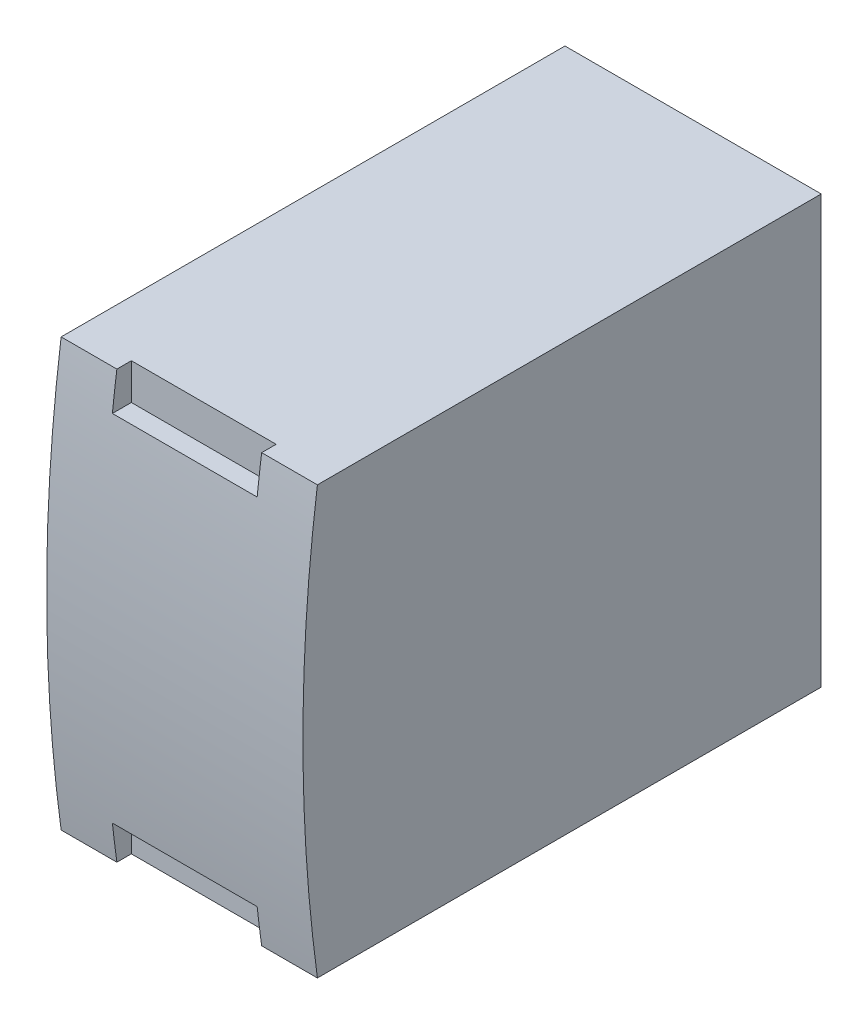
ISO-10303-21;
HEADER;
FILE_DESCRIPTION(('STEP AP214'),'2;1');
FILE_NAME('part.step','',(''),(''),'','','');
FILE_SCHEMA(('AUTOMOTIVE_DESIGN { 1 0 10303 214 1 1 1 1 }'));
ENDSEC;
DATA;
#1=APPLICATION_CONTEXT('core data for automotive mechanical design processes');
#2=APPLICATION_PROTOCOL_DEFINITION('international standard','automotive_design',2000,#1);
#3=PRODUCT_CONTEXT('',#1,'mechanical');
#4=PRODUCT('Part','Part','',(#3));
#5=PRODUCT_RELATED_PRODUCT_CATEGORY('part','',(#4));
#6=PRODUCT_DEFINITION_FORMATION('','',#4);
#7=PRODUCT_DEFINITION_CONTEXT('part definition',#1,'design');
#8=PRODUCT_DEFINITION('design','',#6,#7);
#9=PRODUCT_DEFINITION_SHAPE('','',#8);
#10=(LENGTH_UNIT() NAMED_UNIT(*) SI_UNIT(.MILLI.,.METRE.));
#11=(NAMED_UNIT(*) PLANE_ANGLE_UNIT() SI_UNIT($,.RADIAN.));
#12=(NAMED_UNIT(*) SI_UNIT($,.STERADIAN.) SOLID_ANGLE_UNIT());
#13=UNCERTAINTY_MEASURE_WITH_UNIT(LENGTH_MEASURE(1.E-05),#10,'distance_accuracy_value','');
#14=(GEOMETRIC_REPRESENTATION_CONTEXT(3) GLOBAL_UNCERTAINTY_ASSIGNED_CONTEXT((#13)) GLOBAL_UNIT_ASSIGNED_CONTEXT((#10,
#11,#12)) REPRESENTATION_CONTEXT('',''));
#15=CARTESIAN_POINT('',(0.,0.,0.));
#16=DIRECTION('',(0.,0.,1.));
#17=DIRECTION('',(1.,0.,0.));
#18=AXIS2_PLACEMENT_3D('',#15,#16,#17);
#19=CARTESIAN_POINT('',(0.,0.,85.852));
#20=DIRECTION('',(0.,0.,1.));
#21=DIRECTION('',(1.,0.,0.));
#22=AXIS2_PLACEMENT_3D('',#19,#20,#21);
#23=PLANE('',#22);
#24=DIRECTION('',(0.,1.,0.));
#25=VECTOR('',#24,1.);
#26=CARTESIAN_POINT('',(35.179,68.58,85.852));
#27=LINE('',#26,#25);
#28=CARTESIAN_POINT('',(35.179,68.58,85.852));
#29=VERTEX_POINT('',#28);
#30=CARTESIAN_POINT('',(35.179,74.93,85.852));
#31=VERTEX_POINT('',#30);
#32=EDGE_CURVE('E198',#29,#31,#27,.T.);
#33=ORIENTED_EDGE('',*,*,#32,.T.);
#34=DIRECTION('',(1.,0.,0.));
#35=VECTOR('',#34,1.);
#36=CARTESIAN_POINT('',(44.958,74.93,85.852));
#37=LINE('',#36,#35);
#38=CARTESIAN_POINT('',(9.77899999999998,74.93,85.852));
#39=VERTEX_POINT('',#38);
#40=EDGE_CURVE('E155',#39,#31,#37,.T.);
#41=ORIENTED_EDGE('',*,*,#40,.F.);
#42=DIRECTION('',(0.,-1.,0.));
#43=VECTOR('',#42,1.);
#44=CARTESIAN_POINT('',(9.77899999999999,74.93,85.852));
#45=LINE('',#44,#43);
#46=CARTESIAN_POINT('',(9.77899999999999,68.58,85.852));
#47=VERTEX_POINT('',#46);
#48=EDGE_CURVE('E160',#39,#47,#45,.T.);
#49=ORIENTED_EDGE('',*,*,#48,.T.);
#50=DIRECTION('',(1.,0.,0.));
#51=VECTOR('',#50,1.);
#52=CARTESIAN_POINT('',(9.77899999999999,68.58,85.852));
#53=LINE('',#52,#51);
#54=EDGE_CURVE('E169',#47,#29,#53,.T.);
#55=ORIENTED_EDGE('',*,*,#54,.T.);
#56=EDGE_LOOP('',(#33,#41,#49,#55));
#57=FACE_BOUND('',#56,.T.);
#58=ADVANCED_FACE('F17',(#57),#23,.T.);
#59=CARTESIAN_POINT('',(0.,0.,85.852));
#60=DIRECTION('',(0.,0.,1.));
#61=DIRECTION('',(1.,0.,0.));
#62=AXIS2_PLACEMENT_3D('',#59,#60,#61);
#63=PLANE('',#62);
#64=DIRECTION('',(0.,-1.,0.));
#65=VECTOR('',#64,1.);
#66=CARTESIAN_POINT('',(9.77899999999999,6.34999999999999,85.852));
#67=LINE('',#66,#65);
#68=CARTESIAN_POINT('',(9.77899999999999,6.34999999999999,85.852));
#69=VERTEX_POINT('',#68);
#70=CARTESIAN_POINT('',(9.77899999999999,0.,85.852));
#71=VERTEX_POINT('',#70);
#72=EDGE_CURVE('E83',#69,#71,#67,.T.);
#73=ORIENTED_EDGE('',*,*,#72,.T.);
#74=DIRECTION('',(1.,0.,0.));
#75=VECTOR('',#74,1.);
#76=CARTESIAN_POINT('',(0.,0.,85.852));
#77=LINE('',#76,#75);
#78=CARTESIAN_POINT('',(35.179,0.,85.852));
#79=VERTEX_POINT('',#78);
#80=EDGE_CURVE('E193',#79,#71,#77,.F.);
#81=ORIENTED_EDGE('',*,*,#80,.F.);
#82=DIRECTION('',(0.,1.,0.));
#83=VECTOR('',#82,1.);
#84=CARTESIAN_POINT('',(35.179,0.,85.852));
#85=LINE('',#84,#83);
#86=CARTESIAN_POINT('',(35.179,6.34999999999999,85.852));
#87=VERTEX_POINT('',#86);
#88=EDGE_CURVE('E199',#79,#87,#85,.T.);
#89=ORIENTED_EDGE('',*,*,#88,.T.);
#90=DIRECTION('',(1.,0.,0.));
#91=VECTOR('',#90,1.);
#92=CARTESIAN_POINT('',(35.179,6.34999999999999,85.852));
#93=LINE('',#92,#91);
#94=EDGE_CURVE('E207',#87,#69,#93,.F.);
#95=ORIENTED_EDGE('',*,*,#94,.T.);
#96=EDGE_LOOP('',(#73,#81,#89,#95));
#97=FACE_BOUND('',#96,.T.);
#98=ADVANCED_FACE('F278',(#97),#63,.T.);
#99=CARTESIAN_POINT('',(9.77899999999999,6.34999999999999,90.932));
#100=DIRECTION('',(-1.,0.,0.));
#101=DIRECTION('',(0.,-1.,0.));
#102=AXIS2_PLACEMENT_3D('',#99,#100,#101);
#103=PLANE('',#102);
#104=ORIENTED_EDGE('',*,*,#72,.F.);
#105=DIRECTION('',(0.,0.,1.));
#106=VECTOR('',#105,1.);
#107=CARTESIAN_POINT('',(9.77899999999999,6.34999999999999,90.932));
#108=LINE('',#107,#106);
#109=CARTESIAN_POINT('',(9.77899999999998,6.34999999999997,89.1825521397359));
#110=VERTEX_POINT('',#109);
#111=EDGE_CURVE('E205',#69,#110,#108,.T.);
#112=ORIENTED_EDGE('',*,*,#111,.T.);
#113=CARTESIAN_POINT('',(9.77899999999998,37.465,-186.642374999996));
#114=DIRECTION('',(1.,0.,0.));
#115=DIRECTION('',(0.,0.,-1.));
#116=AXIS2_PLACEMENT_3D('',#113,#114,#115);
#117=CIRCLE('',#116,277.574374999996);
#118=CARTESIAN_POINT('',(9.77899999999998,0.,88.392));
#119=VERTEX_POINT('',#118);
#120=EDGE_CURVE('E20',#119,#110,#117,.F.);
#121=ORIENTED_EDGE('',*,*,#120,.F.);
#122=DIRECTION('',(0.,0.,-1.));
#123=VECTOR('',#122,1.);
#124=CARTESIAN_POINT('',(9.77899999999999,0.,0.));
#125=LINE('',#124,#123);
#126=EDGE_CURVE('E74',#71,#119,#125,.F.);
#127=ORIENTED_EDGE('',*,*,#126,.F.);
#128=EDGE_LOOP('',(#104,#112,#121,#127));
#129=FACE_BOUND('',#128,.T.);
#130=ADVANCED_FACE('F283',(#129),#103,.F.);
#131=CARTESIAN_POINT('',(35.179,6.34999999999999,90.932));
#132=DIRECTION('',(0.,1.,0.));
#133=DIRECTION('',(0.,0.,1.));
#134=AXIS2_PLACEMENT_3D('',#131,#132,#133);
#135=PLANE('',#134);
#136=ORIENTED_EDGE('',*,*,#94,.F.);
#137=DIRECTION('',(0.,0.,-1.));
#138=VECTOR('',#137,1.);
#139=CARTESIAN_POINT('',(35.179,6.34999999999999,90.932));
#140=LINE('',#139,#138);
#141=CARTESIAN_POINT('',(35.179,6.34999999999997,89.1825521397359));
#142=VERTEX_POINT('',#141);
#143=EDGE_CURVE('E196',#87,#142,#140,.F.);
#144=ORIENTED_EDGE('',*,*,#143,.T.);
#145=DIRECTION('',(1.,0.,0.));
#146=VECTOR('',#145,1.);
#147=CARTESIAN_POINT('',(44.958,6.34999999999995,89.1825521397359));
#148=LINE('',#147,#146);
#149=EDGE_CURVE('E202',#110,#142,#148,.T.);
#150=ORIENTED_EDGE('',*,*,#149,.F.);
#151=ORIENTED_EDGE('',*,*,#111,.F.);
#152=EDGE_LOOP('',(#136,#144,#150,#151));
#153=FACE_BOUND('',#152,.T.);
#154=ADVANCED_FACE('F307',(#153),#135,.F.);
#155=CARTESIAN_POINT('',(35.179,0.,90.932));
#156=DIRECTION('',(1.,0.,0.));
#157=DIRECTION('',(0.,0.,-1.));
#158=AXIS2_PLACEMENT_3D('',#155,#156,#157);
#159=PLANE('',#158);
#160=ORIENTED_EDGE('',*,*,#88,.F.);
#161=DIRECTION('',(0.,0.,-1.));
#162=VECTOR('',#161,1.);
#163=CARTESIAN_POINT('',(35.179,0.,0.));
#164=LINE('',#163,#162);
#165=CARTESIAN_POINT('',(35.179,0.,88.392));
#166=VERTEX_POINT('',#165);
#167=EDGE_CURVE('E188',#166,#79,#164,.T.);
#168=ORIENTED_EDGE('',*,*,#167,.F.);
#169=CARTESIAN_POINT('',(35.179,37.465,-186.642374999996));
#170=DIRECTION('',(1.,0.,0.));
#171=DIRECTION('',(0.,0.,-1.));
#172=AXIS2_PLACEMENT_3D('',#169,#170,#171);
#173=CIRCLE('',#172,277.574374999996);
#174=EDGE_CURVE('E186',#142,#166,#173,.T.);
#175=ORIENTED_EDGE('',*,*,#174,.F.);
#176=ORIENTED_EDGE('',*,*,#143,.F.);
#177=EDGE_LOOP('',(#160,#168,#175,#176));
#178=FACE_BOUND('',#177,.T.);
#179=ADVANCED_FACE('F255',(#178),#159,.F.);
#180=CARTESIAN_POINT('',(44.958,0.,0.));
#181=DIRECTION('',(1.,0.,0.));
#182=DIRECTION('',(0.,0.,-1.));
#183=AXIS2_PLACEMENT_3D('',#180,#181,#182);
#184=PLANE('',#183);
#185=DIRECTION('',(0.,0.,1.));
#186=VECTOR('',#185,1.);
#187=CARTESIAN_POINT('',(44.958,74.93,0.));
#188=LINE('',#187,#186);
#189=CARTESIAN_POINT('',(44.958,74.93,88.392));
#190=VERTEX_POINT('',#189);
#191=CARTESIAN_POINT('',(44.958,74.93,0.));
#192=VERTEX_POINT('',#191);
#193=EDGE_CURVE('E120',#190,#192,#188,.F.);
#194=ORIENTED_EDGE('',*,*,#193,.F.);
#195=CARTESIAN_POINT('',(44.958,37.465,-186.642374999996));
#196=DIRECTION('',(1.,0.,0.));
#197=DIRECTION('',(0.,0.,-1.));
#198=AXIS2_PLACEMENT_3D('',#195,#196,#197);
#199=CIRCLE('',#198,277.574374999996);
#200=CARTESIAN_POINT('',(44.958,0.,88.392));
#201=VERTEX_POINT('',#200);
#202=EDGE_CURVE('E175',#201,#190,#199,.F.);
#203=ORIENTED_EDGE('',*,*,#202,.F.);
#204=DIRECTION('',(0.,0.,-1.));
#205=VECTOR('',#204,1.);
#206=CARTESIAN_POINT('',(44.958,0.,0.));
#207=LINE('',#206,#205);
#208=CARTESIAN_POINT('',(44.958,0.,0.));
#209=VERTEX_POINT('',#208);
#210=EDGE_CURVE('E145',#209,#201,#207,.F.);
#211=ORIENTED_EDGE('',*,*,#210,.F.);
#212=DIRECTION('',(0.,1.,0.));
#213=VECTOR('',#212,1.);
#214=CARTESIAN_POINT('',(44.958,0.,0.));
#215=LINE('',#214,#213);
#216=EDGE_CURVE('E123',#209,#192,#215,.T.);
#217=ORIENTED_EDGE('',*,*,#216,.T.);
#218=EDGE_LOOP('',(#194,#203,#211,#217));
#219=FACE_BOUND('',#218,.T.);
#220=ADVANCED_FACE('F260',(#219),#184,.T.);
#221=CARTESIAN_POINT('',(35.179,68.58,90.932));
#222=DIRECTION('',(1.,0.,0.));
#223=DIRECTION('',(0.,0.,-1.));
#224=AXIS2_PLACEMENT_3D('',#221,#222,#223);
#225=PLANE('',#224);
#226=ORIENTED_EDGE('',*,*,#32,.F.);
#227=DIRECTION('',(0.,0.,-1.));
#228=VECTOR('',#227,1.);
#229=CARTESIAN_POINT('',(35.179,68.58,90.932));
#230=LINE('',#229,#228);
#231=CARTESIAN_POINT('',(35.179,68.58,89.1825521397359));
#232=VERTEX_POINT('',#231);
#233=EDGE_CURVE('E167',#29,#232,#230,.F.);
#234=ORIENTED_EDGE('',*,*,#233,.T.);
#235=CARTESIAN_POINT('',(35.179,37.465,-186.642374999996));
#236=DIRECTION('',(1.,0.,0.));
#237=DIRECTION('',(0.,0.,-1.));
#238=AXIS2_PLACEMENT_3D('',#235,#236,#237);
#239=CIRCLE('',#238,277.574374999996);
#240=CARTESIAN_POINT('',(35.179,74.93,88.392));
#241=VERTEX_POINT('',#240);
#242=EDGE_CURVE('E166',#241,#232,#239,.T.);
#243=ORIENTED_EDGE('',*,*,#242,.F.);
#244=DIRECTION('',(0.,0.,1.));
#245=VECTOR('',#244,1.);
#246=CARTESIAN_POINT('',(35.179,74.93,0.));
#247=LINE('',#246,#245);
#248=EDGE_CURVE('E176',#31,#241,#247,.T.);
#249=ORIENTED_EDGE('',*,*,#248,.F.);
#250=EDGE_LOOP('',(#226,#234,#243,#249));
#251=FACE_BOUND('',#250,.T.);
#252=ADVANCED_FACE('F266',(#251),#225,.F.);
#253=CARTESIAN_POINT('',(9.77899999999999,68.58,90.932));
#254=DIRECTION('',(0.,-1.,0.));
#255=DIRECTION('',(0.,0.,-1.));
#256=AXIS2_PLACEMENT_3D('',#253,#254,#255);
#257=PLANE('',#256);
#258=ORIENTED_EDGE('',*,*,#54,.F.);
#259=DIRECTION('',(0.,0.,1.));
#260=VECTOR('',#259,1.);
#261=CARTESIAN_POINT('',(9.77899999999999,68.58,90.932));
#262=LINE('',#261,#260);
#263=CARTESIAN_POINT('',(9.77899999999999,68.58,89.1825521397359));
#264=VERTEX_POINT('',#263);
#265=EDGE_CURVE('E156',#47,#264,#262,.T.);
#266=ORIENTED_EDGE('',*,*,#265,.T.);
#267=DIRECTION('',(1.,0.,0.));
#268=VECTOR('',#267,1.);
#269=CARTESIAN_POINT('',(44.958,68.58,89.1825521397359));
#270=LINE('',#269,#268);
#271=EDGE_CURVE('E163',#232,#264,#270,.F.);
#272=ORIENTED_EDGE('',*,*,#271,.F.);
#273=ORIENTED_EDGE('',*,*,#233,.F.);
#274=EDGE_LOOP('',(#258,#266,#272,#273));
#275=FACE_BOUND('',#274,.T.);
#276=ADVANCED_FACE('F271',(#275),#257,.F.);
#277=CARTESIAN_POINT('',(9.77899999999999,74.93,90.932));
#278=DIRECTION('',(-1.,0.,0.));
#279=DIRECTION('',(0.,-1.,0.));
#280=AXIS2_PLACEMENT_3D('',#277,#278,#279);
#281=PLANE('',#280);
#282=ORIENTED_EDGE('',*,*,#48,.F.);
#283=DIRECTION('',(0.,0.,1.));
#284=VECTOR('',#283,1.);
#285=CARTESIAN_POINT('',(9.77899999999998,74.93,0.));
#286=LINE('',#285,#284);
#287=CARTESIAN_POINT('',(9.77899999999999,74.93,88.392));
#288=VERTEX_POINT('',#287);
#289=EDGE_CURVE('E152',#288,#39,#286,.F.);
#290=ORIENTED_EDGE('',*,*,#289,.F.);
#291=CARTESIAN_POINT('',(9.77899999999999,37.465,-186.642374999996));
#292=DIRECTION('',(1.,0.,0.));
#293=DIRECTION('',(0.,0.,-1.));
#294=AXIS2_PLACEMENT_3D('',#291,#292,#293);
#295=CIRCLE('',#294,277.574374999996);
#296=EDGE_CURVE('E135',#264,#288,#295,.F.);
#297=ORIENTED_EDGE('',*,*,#296,.F.);
#298=ORIENTED_EDGE('',*,*,#265,.F.);
#299=EDGE_LOOP('',(#282,#290,#297,#298));
#300=FACE_BOUND('',#299,.T.);
#301=ADVANCED_FACE('F275',(#300),#281,.F.);
#302=CARTESIAN_POINT('',(44.958,74.93,0.));
#303=DIRECTION('',(0.,1.,0.));
#304=DIRECTION('',(0.,0.,1.));
#305=AXIS2_PLACEMENT_3D('',#302,#303,#304);
#306=PLANE('',#305);
#307=DIRECTION('',(0.,0.,1.));
#308=VECTOR('',#307,1.);
#309=CARTESIAN_POINT('',(0.,74.93,0.));
#310=LINE('',#309,#308);
#311=CARTESIAN_POINT('',(0.,74.93,88.392));
#312=VERTEX_POINT('',#311);
#313=CARTESIAN_POINT('',(0.,74.93,0.));
#314=VERTEX_POINT('',#313);
#315=EDGE_CURVE('E117',#312,#314,#310,.F.);
#316=ORIENTED_EDGE('',*,*,#315,.F.);
#317=DIRECTION('',(1.,0.,0.));
#318=VECTOR('',#317,1.);
#319=CARTESIAN_POINT('',(44.958,74.93,88.392));
#320=LINE('',#319,#318);
#321=EDGE_CURVE('E133',#288,#312,#320,.F.);
#322=ORIENTED_EDGE('',*,*,#321,.F.);
#323=ORIENTED_EDGE('',*,*,#289,.T.);
#324=ORIENTED_EDGE('',*,*,#40,.T.);
#325=ORIENTED_EDGE('',*,*,#248,.T.);
#326=DIRECTION('',(1.,0.,0.));
#327=VECTOR('',#326,1.);
#328=CARTESIAN_POINT('',(44.958,74.93,88.392));
#329=LINE('',#328,#327);
#330=EDGE_CURVE('E172',#190,#241,#329,.F.);
#331=ORIENTED_EDGE('',*,*,#330,.F.);
#332=ORIENTED_EDGE('',*,*,#193,.T.);
#333=DIRECTION('',(1.,0.,0.));
#334=VECTOR('',#333,1.);
#335=CARTESIAN_POINT('',(0.,74.93,0.));
#336=LINE('',#335,#334);
#337=EDGE_CURVE('E112',#192,#314,#336,.F.);
#338=ORIENTED_EDGE('',*,*,#337,.T.);
#339=EDGE_LOOP('',(#316,#322,#323,#324,#325,#331,#332,#338));
#340=FACE_BOUND('',#339,.T.);
#341=ADVANCED_FACE('F114',(#340),#306,.T.);
#342=CARTESIAN_POINT('',(0.,0.,0.));
#343=DIRECTION('',(0.,0.,1.));
#344=DIRECTION('',(1.,0.,0.));
#345=AXIS2_PLACEMENT_3D('',#342,#343,#344);
#346=PLANE('',#345);
#347=ORIENTED_EDGE('',*,*,#216,.F.);
#348=DIRECTION('',(1.,0.,0.));
#349=VECTOR('',#348,1.);
#350=CARTESIAN_POINT('',(0.,0.,0.));
#351=LINE('',#350,#349);
#352=CARTESIAN_POINT('',(0.,0.,0.));
#353=VERTEX_POINT('',#352);
#354=EDGE_CURVE('E122',#353,#209,#351,.T.);
#355=ORIENTED_EDGE('',*,*,#354,.F.);
#356=DIRECTION('',(0.,1.,0.));
#357=VECTOR('',#356,1.);
#358=CARTESIAN_POINT('',(0.,74.93,0.));
#359=LINE('',#358,#357);
#360=EDGE_CURVE('E126',#314,#353,#359,.F.);
#361=ORIENTED_EDGE('',*,*,#360,.F.);
#362=ORIENTED_EDGE('',*,*,#337,.F.);
#363=EDGE_LOOP('',(#347,#355,#361,#362));
#364=FACE_BOUND('',#363,.T.);
#365=ADVANCED_FACE('F127',(#364),#346,.F.);
#366=CARTESIAN_POINT('',(0.,0.,0.));
#367=DIRECTION('',(0.,-1.,0.));
#368=DIRECTION('',(0.,0.,-1.));
#369=AXIS2_PLACEMENT_3D('',#366,#367,#368);
#370=PLANE('',#369);
#371=ORIENTED_EDGE('',*,*,#126,.T.);
#372=DIRECTION('',(1.,0.,0.));
#373=VECTOR('',#372,1.);
#374=CARTESIAN_POINT('',(44.958,0.,88.392));
#375=LINE('',#374,#373);
#376=CARTESIAN_POINT('',(0.,0.,88.392));
#377=VERTEX_POINT('',#376);
#378=EDGE_CURVE('E35',#377,#119,#375,.T.);
#379=ORIENTED_EDGE('',*,*,#378,.F.);
#380=DIRECTION('',(0.,0.,1.));
#381=VECTOR('',#380,1.);
#382=CARTESIAN_POINT('',(0.,0.,0.));
#383=LINE('',#382,#381);
#384=EDGE_CURVE('E26',#353,#377,#383,.T.);
#385=ORIENTED_EDGE('',*,*,#384,.F.);
#386=ORIENTED_EDGE('',*,*,#354,.T.);
#387=ORIENTED_EDGE('',*,*,#210,.T.);
#388=DIRECTION('',(1.,0.,0.));
#389=VECTOR('',#388,1.);
#390=CARTESIAN_POINT('',(44.958,0.,88.392));
#391=LINE('',#390,#389);
#392=EDGE_CURVE('E183',#166,#201,#391,.T.);
#393=ORIENTED_EDGE('',*,*,#392,.F.);
#394=ORIENTED_EDGE('',*,*,#167,.T.);
#395=ORIENTED_EDGE('',*,*,#80,.T.);
#396=EDGE_LOOP('',(#371,#379,#385,#386,#387,#393,#394,#395));
#397=FACE_BOUND('',#396,.T.);
#398=ADVANCED_FACE('F256',(#397),#370,.T.);
#399=CARTESIAN_POINT('',(44.958,37.465,-186.642374999996));
#400=DIRECTION('',(1.,0.,0.));
#401=DIRECTION('',(0.,0.,-1.));
#402=AXIS2_PLACEMENT_3D('',#399,#400,#401);
#403=CYLINDRICAL_SURFACE('',#402,277.574374999996);
#404=ORIENTED_EDGE('',*,*,#321,.T.);
#405=CARTESIAN_POINT('',(0.,37.465,-186.642374999996));
#406=DIRECTION('',(1.,0.,0.));
#407=DIRECTION('',(0.,0.,-1.));
#408=AXIS2_PLACEMENT_3D('',#405,#406,#407);
#409=CIRCLE('',#408,277.574374999996);
#410=EDGE_CURVE('E11',#377,#312,#409,.F.);
#411=ORIENTED_EDGE('',*,*,#410,.F.);
#412=ORIENTED_EDGE('',*,*,#378,.T.);
#413=ORIENTED_EDGE('',*,*,#120,.T.);
#414=ORIENTED_EDGE('',*,*,#149,.T.);
#415=ORIENTED_EDGE('',*,*,#174,.T.);
#416=ORIENTED_EDGE('',*,*,#392,.T.);
#417=ORIENTED_EDGE('',*,*,#202,.T.);
#418=ORIENTED_EDGE('',*,*,#330,.T.);
#419=ORIENTED_EDGE('',*,*,#242,.T.);
#420=ORIENTED_EDGE('',*,*,#271,.T.);
#421=ORIENTED_EDGE('',*,*,#296,.T.);
#422=EDGE_LOOP('',(#404,#411,#412,#413,#414,#415,#416,#417,#418,#419,#420,#421));
#423=FACE_BOUND('',#422,.T.);
#424=ADVANCED_FACE('F249',(#423),#403,.T.);
#425=CARTESIAN_POINT('',(0.,74.93,0.));
#426=DIRECTION('',(-1.,0.,0.));
#427=DIRECTION('',(0.,0.,1.));
#428=AXIS2_PLACEMENT_3D('',#425,#426,#427);
#429=PLANE('',#428);
#430=ORIENTED_EDGE('',*,*,#384,.T.);
#431=ORIENTED_EDGE('',*,*,#410,.T.);
#432=ORIENTED_EDGE('',*,*,#315,.T.);
#433=ORIENTED_EDGE('',*,*,#360,.T.);
#434=EDGE_LOOP('',(#430,#431,#432,#433));
#435=FACE_BOUND('',#434,.T.);
#436=ADVANCED_FACE('F132',(#435),#429,.T.);
#437=CLOSED_SHELL('',(#58,#98,#130,#154,#179,#220,#252,#276,#301,#341,#365,#398,#424,#436));
#438=MANIFOLD_SOLID_BREP('B1',#437);
#439=ADVANCED_BREP_SHAPE_REPRESENTATION('',(#18,#438),#14);
#440=SHAPE_DEFINITION_REPRESENTATION(#9,#439);
ENDSEC;
END-ISO-10303-21;
